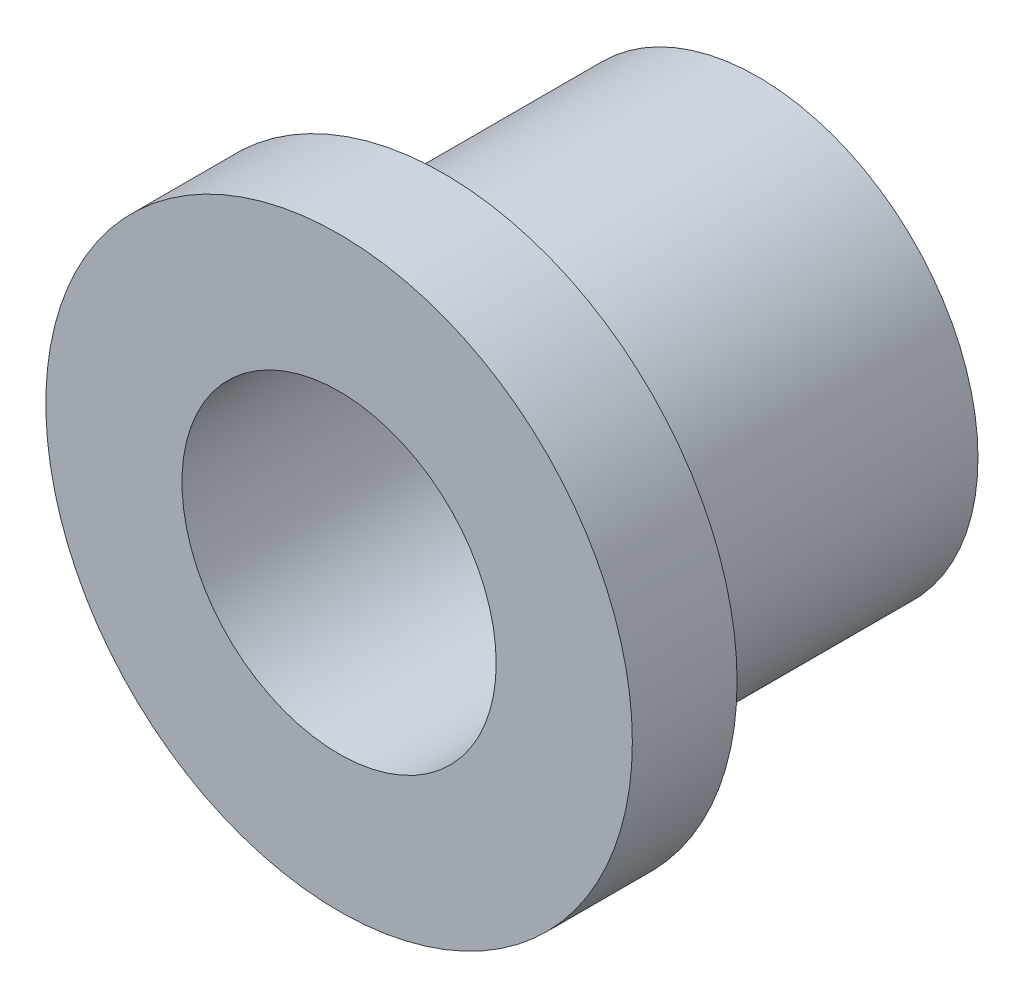
ISO-10303-21;
HEADER;
FILE_DESCRIPTION(('STEP AP214'),'2;1');
FILE_NAME('part.step','',(''),(''),'','','');
FILE_SCHEMA(('AUTOMOTIVE_DESIGN { 1 0 10303 214 1 1 1 1 }'));
ENDSEC;
DATA;
#1=APPLICATION_CONTEXT('core data for automotive mechanical design processes');
#2=APPLICATION_PROTOCOL_DEFINITION('international standard','automotive_design',2000,#1);
#3=PRODUCT_CONTEXT('',#1,'mechanical');
#4=PRODUCT('Part','Part','',(#3));
#5=PRODUCT_RELATED_PRODUCT_CATEGORY('part','',(#4));
#6=PRODUCT_DEFINITION_FORMATION('','',#4);
#7=PRODUCT_DEFINITION_CONTEXT('part definition',#1,'design');
#8=PRODUCT_DEFINITION('design','',#6,#7);
#9=PRODUCT_DEFINITION_SHAPE('','',#8);
#10=(LENGTH_UNIT() NAMED_UNIT(*) SI_UNIT(.MILLI.,.METRE.));
#11=(NAMED_UNIT(*) PLANE_ANGLE_UNIT() SI_UNIT($,.RADIAN.));
#12=(NAMED_UNIT(*) SI_UNIT($,.STERADIAN.) SOLID_ANGLE_UNIT());
#13=UNCERTAINTY_MEASURE_WITH_UNIT(LENGTH_MEASURE(1.E-05),#10,'distance_accuracy_value','');
#14=(GEOMETRIC_REPRESENTATION_CONTEXT(3) GLOBAL_UNCERTAINTY_ASSIGNED_CONTEXT((#13)) GLOBAL_UNIT_ASSIGNED_CONTEXT((#10,
#11,#12)) REPRESENTATION_CONTEXT('',''));
#15=CARTESIAN_POINT('',(0.,0.,0.));
#16=DIRECTION('',(0.,0.,1.));
#17=DIRECTION('',(1.,0.,0.));
#18=AXIS2_PLACEMENT_3D('',#15,#16,#17);
#19=CARTESIAN_POINT('',(0.,0.,0.));
#20=DIRECTION('',(0.,0.,1.));
#21=DIRECTION('',(1.,0.,0.));
#22=AXIS2_PLACEMENT_3D('',#19,#20,#21);
#23=PLANE('',#22);
#24=CARTESIAN_POINT('',(0.,0.,0.));
#25=DIRECTION('',(0.,0.,1.));
#26=DIRECTION('',(1.,0.,0.));
#27=AXIS2_PLACEMENT_3D('',#24,#25,#26);
#28=CIRCLE('',#27,10.5);
#29=CARTESIAN_POINT('',(10.5,0.,0.));
#30=VERTEX_POINT('',#29);
#31=EDGE_CURVE('E36',#30,#30,#28,.T.);
#32=ORIENTED_EDGE('',*,*,#31,.F.);
#33=EDGE_LOOP('',(#32));
#34=FACE_BOUND('',#33,.T.);
#35=CARTESIAN_POINT('',(0.,0.,0.));
#36=DIRECTION('',(0.,0.,1.));
#37=DIRECTION('',(1.,0.,0.));
#38=AXIS2_PLACEMENT_3D('',#35,#36,#37);
#39=CIRCLE('',#38,7.5);
#40=CARTESIAN_POINT('',(7.5,0.,0.));
#41=VERTEX_POINT('',#40);
#42=EDGE_CURVE('E43',#41,#41,#39,.T.);
#43=ORIENTED_EDGE('',*,*,#42,.T.);
#44=EDGE_LOOP('',(#43));
#45=FACE_BOUND('',#44,.T.);
#46=ADVANCED_FACE('F32',(#34,#45),#23,.F.);
#47=CARTESIAN_POINT('',(0.,0.,15.));
#48=DIRECTION('',(0.,0.,-1.));
#49=DIRECTION('',(-1.,0.,0.));
#50=AXIS2_PLACEMENT_3D('',#47,#48,#49);
#51=CYLINDRICAL_SURFACE('',#50,10.5);
#52=CARTESIAN_POINT('',(0.,0.,15.));
#53=DIRECTION('',(0.,0.,1.));
#54=DIRECTION('',(1.,0.,0.));
#55=AXIS2_PLACEMENT_3D('',#52,#53,#54);
#56=CIRCLE('',#55,10.5);
#57=CARTESIAN_POINT('',(10.5,0.,15.));
#58=VERTEX_POINT('',#57);
#59=EDGE_CURVE('E10',#58,#58,#56,.T.);
#60=ORIENTED_EDGE('',*,*,#59,.F.);
#61=EDGE_LOOP('',(#60));
#62=FACE_BOUND('',#61,.T.);
#63=ORIENTED_EDGE('',*,*,#31,.T.);
#64=EDGE_LOOP('',(#63));
#65=FACE_BOUND('',#64,.T.);
#66=ADVANCED_FACE('F34',(#62,#65),#51,.T.);
#67=CARTESIAN_POINT('',(0.,0.,15.));
#68=DIRECTION('',(0.,0.,-1.));
#69=DIRECTION('',(-1.,0.,0.));
#70=AXIS2_PLACEMENT_3D('',#67,#68,#69);
#71=CYLINDRICAL_SURFACE('',#70,7.5);
#72=ORIENTED_EDGE('',*,*,#42,.F.);
#73=EDGE_LOOP('',(#72));
#74=FACE_BOUND('',#73,.T.);
#75=CARTESIAN_POINT('',(0.,0.,20.));
#76=DIRECTION('',(0.,0.,1.));
#77=DIRECTION('',(1.,0.,0.));
#78=AXIS2_PLACEMENT_3D('',#75,#76,#77);
#79=CIRCLE('',#78,7.5);
#80=CARTESIAN_POINT('',(7.5,0.,20.));
#81=VERTEX_POINT('',#80);
#82=EDGE_CURVE('E51',#81,#81,#79,.T.);
#83=ORIENTED_EDGE('',*,*,#82,.T.);
#84=EDGE_LOOP('',(#83));
#85=FACE_BOUND('',#84,.T.);
#86=ADVANCED_FACE('F57',(#74,#85),#71,.F.);
#87=CARTESIAN_POINT('',(0.,0.,20.));
#88=DIRECTION('',(0.,0.,1.));
#89=DIRECTION('',(1.,0.,0.));
#90=AXIS2_PLACEMENT_3D('',#87,#88,#89);
#91=PLANE('',#90);
#92=CARTESIAN_POINT('',(0.,0.,20.));
#93=DIRECTION('',(0.,0.,1.));
#94=DIRECTION('',(1.,0.,0.));
#95=AXIS2_PLACEMENT_3D('',#92,#93,#94);
#96=CIRCLE('',#95,14.);
#97=CARTESIAN_POINT('',(14.,0.,20.));
#98=VERTEX_POINT('',#97);
#99=EDGE_CURVE('E47',#98,#98,#96,.T.);
#100=ORIENTED_EDGE('',*,*,#99,.T.);
#101=EDGE_LOOP('',(#100));
#102=FACE_BOUND('',#101,.T.);
#103=ORIENTED_EDGE('',*,*,#82,.F.);
#104=EDGE_LOOP('',(#103));
#105=FACE_BOUND('',#104,.T.);
#106=ADVANCED_FACE('F59',(#102,#105),#91,.T.);
#107=CARTESIAN_POINT('',(0.,0.,15.));
#108=DIRECTION('',(0.,0.,1.));
#109=DIRECTION('',(1.,0.,0.));
#110=AXIS2_PLACEMENT_3D('',#107,#108,#109);
#111=PLANE('',#110);
#112=ORIENTED_EDGE('',*,*,#59,.T.);
#113=EDGE_LOOP('',(#112));
#114=FACE_BOUND('',#113,.T.);
#115=CARTESIAN_POINT('',(0.,0.,15.));
#116=DIRECTION('',(0.,0.,1.));
#117=DIRECTION('',(1.,0.,0.));
#118=AXIS2_PLACEMENT_3D('',#115,#116,#117);
#119=CIRCLE('',#118,14.);
#120=CARTESIAN_POINT('',(14.,0.,15.));
#121=VERTEX_POINT('',#120);
#122=EDGE_CURVE('E48',#121,#121,#119,.T.);
#123=ORIENTED_EDGE('',*,*,#122,.F.);
#124=EDGE_LOOP('',(#123));
#125=FACE_BOUND('',#124,.T.);
#126=ADVANCED_FACE('F61',(#114,#125),#111,.F.);
#127=CARTESIAN_POINT('',(0.,0.,20.));
#128=DIRECTION('',(0.,0.,-1.));
#129=DIRECTION('',(-1.,0.,0.));
#130=AXIS2_PLACEMENT_3D('',#127,#128,#129);
#131=CYLINDRICAL_SURFACE('',#130,14.);
#132=ORIENTED_EDGE('',*,*,#99,.F.);
#133=EDGE_LOOP('',(#132));
#134=FACE_BOUND('',#133,.T.);
#135=ORIENTED_EDGE('',*,*,#122,.T.);
#136=EDGE_LOOP('',(#135));
#137=FACE_BOUND('',#136,.T.);
#138=ADVANCED_FACE('F68',(#134,#137),#131,.T.);
#139=CLOSED_SHELL('',(#46,#66,#86,#106,#126,#138));
#140=MANIFOLD_SOLID_BREP('B2',#139);
#141=ADVANCED_BREP_SHAPE_REPRESENTATION('',(#18,#140),#14);
#142=SHAPE_DEFINITION_REPRESENTATION(#9,#141);
ENDSEC;
END-ISO-10303-21;
